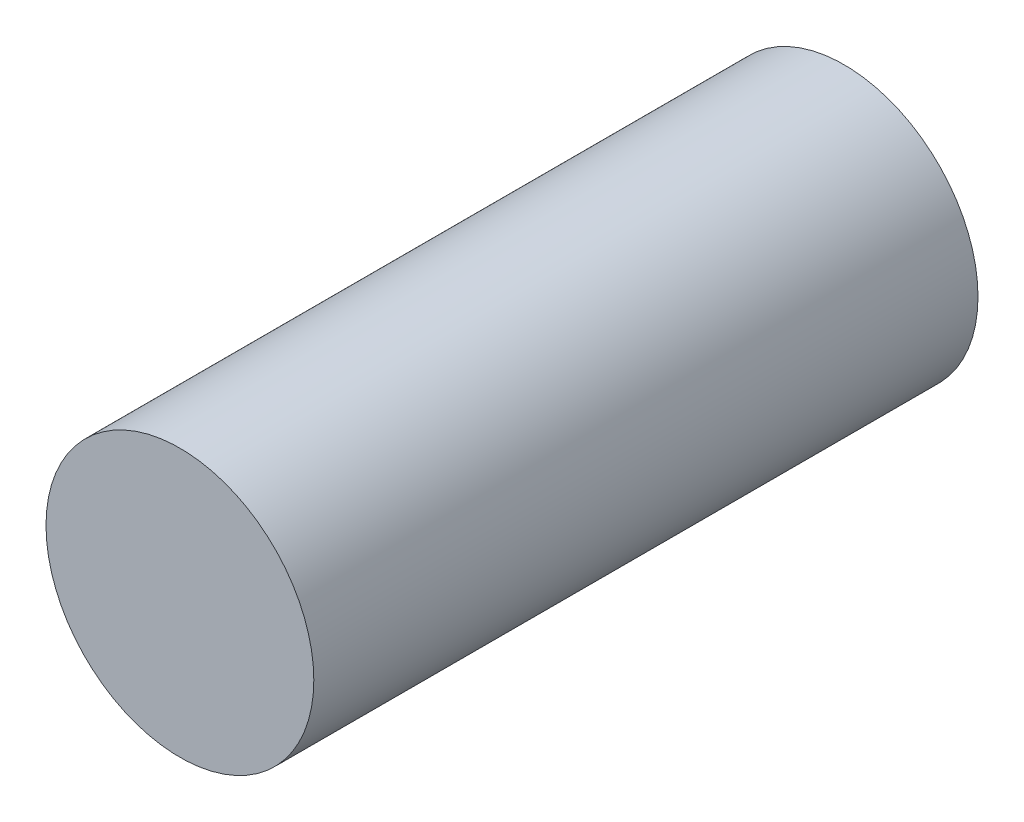
ISO-10303-21;
HEADER;
FILE_DESCRIPTION(('STEP AP214'),'2;1');
FILE_NAME('part.step','',(''),(''),'','','');
FILE_SCHEMA(('AUTOMOTIVE_DESIGN { 1 0 10303 214 1 1 1 1 }'));
ENDSEC;
DATA;
#1=APPLICATION_CONTEXT('core data for automotive mechanical design processes');
#2=APPLICATION_PROTOCOL_DEFINITION('international standard','automotive_design',2000,#1);
#3=PRODUCT_CONTEXT('',#1,'mechanical');
#4=PRODUCT('Part','Part','',(#3));
#5=PRODUCT_RELATED_PRODUCT_CATEGORY('part','',(#4));
#6=PRODUCT_DEFINITION_FORMATION('','',#4);
#7=PRODUCT_DEFINITION_CONTEXT('part definition',#1,'design');
#8=PRODUCT_DEFINITION('design','',#6,#7);
#9=PRODUCT_DEFINITION_SHAPE('','',#8);
#10=(LENGTH_UNIT() NAMED_UNIT(*) SI_UNIT(.MILLI.,.METRE.));
#11=(NAMED_UNIT(*) PLANE_ANGLE_UNIT() SI_UNIT($,.RADIAN.));
#12=(NAMED_UNIT(*) SI_UNIT($,.STERADIAN.) SOLID_ANGLE_UNIT());
#13=UNCERTAINTY_MEASURE_WITH_UNIT(LENGTH_MEASURE(1.E-05),#10,'distance_accuracy_value','');
#14=(GEOMETRIC_REPRESENTATION_CONTEXT(3) GLOBAL_UNCERTAINTY_ASSIGNED_CONTEXT((#13)) GLOBAL_UNIT_ASSIGNED_CONTEXT((#10,
#11,#12)) REPRESENTATION_CONTEXT('',''));
#15=CARTESIAN_POINT('',(0.,0.,0.));
#16=DIRECTION('',(0.,0.,1.));
#17=DIRECTION('',(1.,0.,0.));
#18=AXIS2_PLACEMENT_3D('',#15,#16,#17);
#19=CARTESIAN_POINT('',(0.,0.,12.4));
#20=DIRECTION('',(0.,0.,-1.));
#21=DIRECTION('',(-1.,0.,0.));
#22=AXIS2_PLACEMENT_3D('',#19,#20,#21);
#23=CYLINDRICAL_SURFACE('',#22,2.5);
#24=CARTESIAN_POINT('',(0.,0.,12.4));
#25=DIRECTION('',(0.,0.,1.));
#26=DIRECTION('',(1.,0.,0.));
#27=AXIS2_PLACEMENT_3D('',#24,#25,#26);
#28=CIRCLE('',#27,2.5);
#29=CARTESIAN_POINT('',(-2.5,0.,12.4));
#30=VERTEX_POINT('',#29);
#31=EDGE_CURVE('E10',#30,#30,#28,.T.);
#32=CARTESIAN_POINT('',(0.,0.,0.));
#33=DIRECTION('',(0.,0.,1.));
#34=DIRECTION('',(1.,0.,0.));
#35=AXIS2_PLACEMENT_3D('',#32,#33,#34);
#36=CIRCLE('',#35,2.5);
#37=CARTESIAN_POINT('',(-2.5,0.,0.));
#38=VERTEX_POINT('',#37);
#39=EDGE_CURVE('E42',#38,#38,#36,.T.);
#40=CARTESIAN_POINT('',(-2.5,0.,12.4));
#41=CARTESIAN_POINT('',(-2.5,0.,12.2708333333333));
#42=CARTESIAN_POINT('',(-2.5,0.,12.1416666666667));
#43=CARTESIAN_POINT('',(-2.5,0.,11.8833333333333));
#44=CARTESIAN_POINT('',(-2.5,0.,11.7541666666667));
#45=CARTESIAN_POINT('',(-2.5,0.,11.4958333333333));
#46=CARTESIAN_POINT('',(-2.5,0.,11.3666666666667));
#47=CARTESIAN_POINT('',(-2.5,0.,11.1083333333333));
#48=CARTESIAN_POINT('',(-2.5,0.,10.9791666666667));
#49=CARTESIAN_POINT('',(-2.5,0.,10.7208333333333));
#50=CARTESIAN_POINT('',(-2.5,0.,10.5916666666667));
#51=CARTESIAN_POINT('',(-2.5,0.,10.3333333333333));
#52=CARTESIAN_POINT('',(-2.5,0.,10.2041666666667));
#53=CARTESIAN_POINT('',(-2.5,0.,9.94583333333333));
#54=CARTESIAN_POINT('',(-2.5,0.,9.81666666666666));
#55=CARTESIAN_POINT('',(-2.5,0.,9.55833333333333));
#56=CARTESIAN_POINT('',(-2.5,0.,9.42916666666667));
#57=CARTESIAN_POINT('',(-2.5,0.,9.17083333333333));
#58=CARTESIAN_POINT('',(-2.5,0.,9.04166666666667));
#59=CARTESIAN_POINT('',(-2.5,0.,8.78333333333333));
#60=CARTESIAN_POINT('',(-2.5,0.,8.65416666666667));
#61=CARTESIAN_POINT('',(-2.5,0.,8.39583333333333));
#62=CARTESIAN_POINT('',(-2.5,0.,8.26666666666667));
#63=CARTESIAN_POINT('',(-2.5,0.,8.00833333333333));
#64=CARTESIAN_POINT('',(-2.5,0.,7.87916666666667));
#65=CARTESIAN_POINT('',(-2.5,0.,7.62083333333333));
#66=CARTESIAN_POINT('',(-2.5,0.,7.49166666666667));
#67=CARTESIAN_POINT('',(-2.5,0.,7.23333333333333));
#68=CARTESIAN_POINT('',(-2.5,0.,7.10416666666667));
#69=CARTESIAN_POINT('',(-2.5,0.,6.84583333333333));
#70=CARTESIAN_POINT('',(-2.5,0.,6.71666666666667));
#71=CARTESIAN_POINT('',(-2.5,0.,6.45833333333333));
#72=CARTESIAN_POINT('',(-2.5,0.,6.32916666666667));
#73=CARTESIAN_POINT('',(-2.5,0.,6.07083333333333));
#74=CARTESIAN_POINT('',(-2.5,0.,5.94166666666667));
#75=CARTESIAN_POINT('',(-2.5,0.,5.68333333333333));
#76=CARTESIAN_POINT('',(-2.5,0.,5.55416666666667));
#77=CARTESIAN_POINT('',(-2.5,0.,5.29583333333333));
#78=CARTESIAN_POINT('',(-2.5,0.,5.16666666666667));
#79=CARTESIAN_POINT('',(-2.5,0.,4.90833333333333));
#80=CARTESIAN_POINT('',(-2.5,0.,4.77916666666667));
#81=CARTESIAN_POINT('',(-2.5,0.,4.52083333333333));
#82=CARTESIAN_POINT('',(-2.5,0.,4.39166666666667));
#83=CARTESIAN_POINT('',(-2.5,0.,4.13333333333333));
#84=CARTESIAN_POINT('',(-2.5,0.,4.00416666666667));
#85=CARTESIAN_POINT('',(-2.5,0.,3.74583333333333));
#86=CARTESIAN_POINT('',(-2.5,0.,3.61666666666667));
#87=CARTESIAN_POINT('',(-2.5,0.,3.35833333333333));
#88=CARTESIAN_POINT('',(-2.5,0.,3.22916666666667));
#89=CARTESIAN_POINT('',(-2.5,0.,2.97083333333333));
#90=CARTESIAN_POINT('',(-2.5,0.,2.84166666666667));
#91=CARTESIAN_POINT('',(-2.5,0.,2.58333333333333));
#92=CARTESIAN_POINT('',(-2.5,0.,2.45416666666667));
#93=CARTESIAN_POINT('',(-2.5,0.,2.19583333333333));
#94=CARTESIAN_POINT('',(-2.5,0.,2.06666666666667));
#95=CARTESIAN_POINT('',(-2.5,0.,1.80833333333333));
#96=CARTESIAN_POINT('',(-2.5,0.,1.67916666666667));
#97=CARTESIAN_POINT('',(-2.5,0.,1.42083333333333));
#98=CARTESIAN_POINT('',(-2.5,0.,1.29166666666667));
#99=CARTESIAN_POINT('',(-2.5,0.,1.03333333333333));
#100=CARTESIAN_POINT('',(-2.5,0.,0.904166666666667));
#101=CARTESIAN_POINT('',(-2.5,0.,0.645833333333333));
#102=CARTESIAN_POINT('',(-2.5,0.,0.516666666666667));
#103=CARTESIAN_POINT('',(-2.5,0.,0.258333333333334));
#104=CARTESIAN_POINT('',(-2.5,0.,0.129166666666667));
#105=CARTESIAN_POINT('',(-2.5,0.,0.));
#106=B_SPLINE_CURVE_WITH_KNOTS('',3,(#40,#41,#42,#43,#44,#45,#46,#47,#48,#49,#50,#51,#52,#53,
#54,#55,#56,#57,#58,#59,#60,#61,#62,#63,#64,#65,#66,#67,#68,#69,#70,#71,#72,#73,#74,#75,#76,#77,
#78,#79,#80,#81,#82,#83,#84,#85,#86,#87,#88,#89,#90,#91,#92,#93,#94,#95,#96,#97,#98,#99,#100,
#101,#102,#103,#104,#105),.UNSPECIFIED.,.F.,.F.,(4,2,2,2,2,2,2,2,2,2,2,2,2,2,2,2,2,2,2,2,2,2,2,
2,2,2,2,2,2,2,2,2,4),(0.,0.387499999999999,0.775,1.1625,1.55,1.9375,2.325,2.7125,3.1,3.4875,
3.875,4.2625,4.65,5.0375,5.425,5.8125,6.2,6.5875,6.975,7.3625,7.75,8.1375,8.525,8.9125,9.3,
9.6875,10.075,10.4625,10.85,11.2375,11.625,12.0125,12.4),.UNSPECIFIED.);
#107=EDGE_CURVE('BSEAM39',#30,#38,#106,.T.);
#108=ORIENTED_EDGE('',*,*,#31,.F.);
#109=ORIENTED_EDGE('',*,*,#39,.T.);
#110=ORIENTED_EDGE('',*,*,#107,.T.);
#111=ORIENTED_EDGE('',*,*,#107,.F.);
#112=EDGE_LOOP('',(#108,#110,#109,#111));
#113=FACE_BOUND('',#112,.T.);
#114=ADVANCED_FACE('F39',(#113),#23,.T.);
#115=CARTESIAN_POINT('',(0.,0.,12.4));
#116=DIRECTION('',(0.,0.,1.));
#117=DIRECTION('',(1.,0.,0.));
#118=AXIS2_PLACEMENT_3D('',#115,#116,#117);
#119=PLANE('',#118);
#120=ORIENTED_EDGE('',*,*,#31,.T.);
#121=EDGE_LOOP('',(#120));
#122=FACE_BOUND('',#121,.T.);
#123=ADVANCED_FACE('F54',(#122),#119,.T.);
#124=CARTESIAN_POINT('',(0.,0.,0.));
#125=DIRECTION('',(0.,0.,1.));
#126=DIRECTION('',(1.,0.,0.));
#127=AXIS2_PLACEMENT_3D('',#124,#125,#126);
#128=PLANE('',#127);
#129=ORIENTED_EDGE('',*,*,#39,.F.);
#130=EDGE_LOOP('',(#129));
#131=FACE_BOUND('',#130,.T.);
#132=ADVANCED_FACE('F52',(#131),#128,.F.);
#133=CLOSED_SHELL('',(#114,#123,#132));
#134=MANIFOLD_SOLID_BREP('B2',#133);
#135=ADVANCED_BREP_SHAPE_REPRESENTATION('',(#18,#134),#14);
#136=SHAPE_DEFINITION_REPRESENTATION(#9,#135);
ENDSEC;
END-ISO-10303-21;
